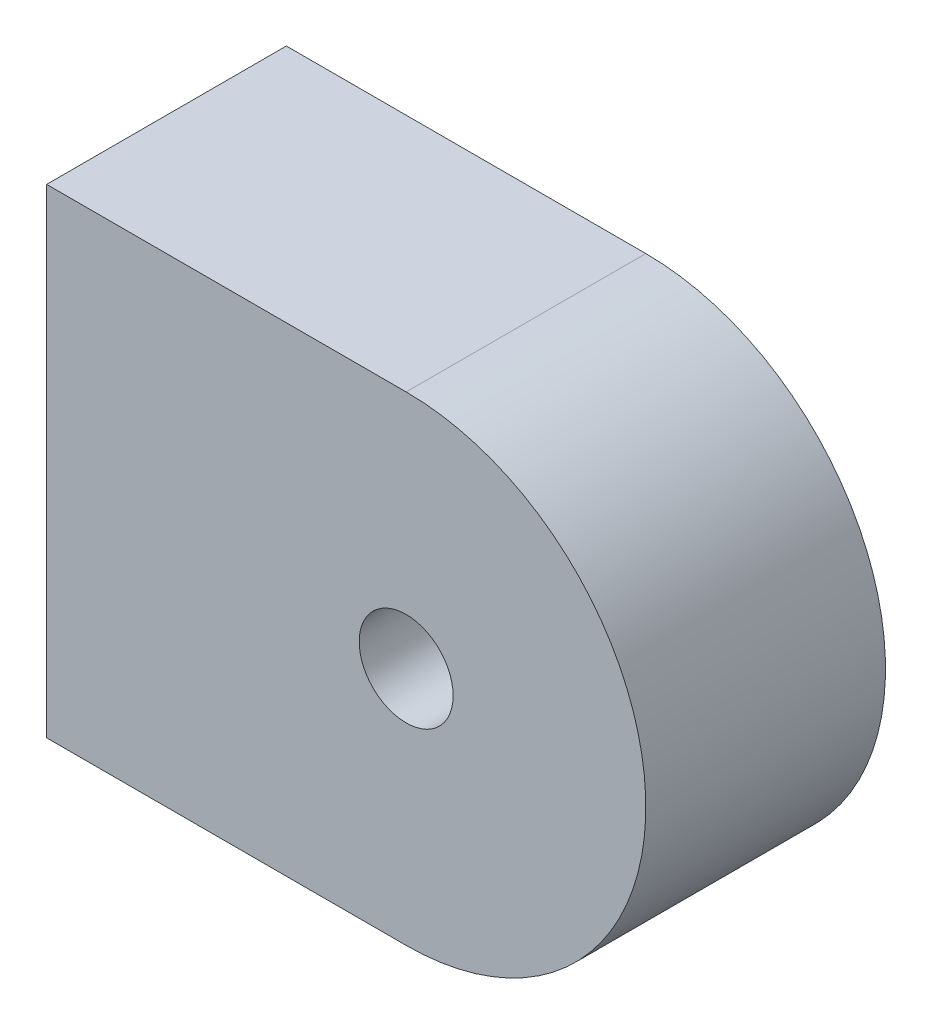
ISO-10303-21;
HEADER;
FILE_DESCRIPTION(('STEP AP214'),'2;1');
FILE_NAME('part.step','',(''),(''),'','','');
FILE_SCHEMA(('AUTOMOTIVE_DESIGN { 1 0 10303 214 1 1 1 1 }'));
ENDSEC;
DATA;
#1=APPLICATION_CONTEXT('core data for automotive mechanical design processes');
#2=APPLICATION_PROTOCOL_DEFINITION('international standard','automotive_design',2000,#1);
#3=PRODUCT_CONTEXT('',#1,'mechanical');
#4=PRODUCT('Part','Part','',(#3));
#5=PRODUCT_RELATED_PRODUCT_CATEGORY('part','',(#4));
#6=PRODUCT_DEFINITION_FORMATION('','',#4);
#7=PRODUCT_DEFINITION_CONTEXT('part definition',#1,'design');
#8=PRODUCT_DEFINITION('design','',#6,#7);
#9=PRODUCT_DEFINITION_SHAPE('','',#8);
#10=(LENGTH_UNIT() NAMED_UNIT(*) SI_UNIT(.MILLI.,.METRE.));
#11=(NAMED_UNIT(*) PLANE_ANGLE_UNIT() SI_UNIT($,.RADIAN.));
#12=(NAMED_UNIT(*) SI_UNIT($,.STERADIAN.) SOLID_ANGLE_UNIT());
#13=UNCERTAINTY_MEASURE_WITH_UNIT(LENGTH_MEASURE(1.E-05),#10,'distance_accuracy_value','');
#14=(GEOMETRIC_REPRESENTATION_CONTEXT(3) GLOBAL_UNCERTAINTY_ASSIGNED_CONTEXT((#13)) GLOBAL_UNIT_ASSIGNED_CONTEXT((#10,
#11,#12)) REPRESENTATION_CONTEXT('',''));
#15=CARTESIAN_POINT('',(0.,0.,0.));
#16=DIRECTION('',(0.,0.,1.));
#17=DIRECTION('',(1.,0.,0.));
#18=AXIS2_PLACEMENT_3D('',#15,#16,#17);
#19=CARTESIAN_POINT('',(31.7500000000001,645.8585,-12.7));
#20=DIRECTION('',(0.,0.,1.));
#21=DIRECTION('',(1.,0.,0.));
#22=AXIS2_PLACEMENT_3D('',#19,#20,#21);
#23=CYLINDRICAL_SURFACE('',#22,12.7);
#24=CARTESIAN_POINT('',(31.7500000000001,645.8585,0.));
#25=DIRECTION('',(0.,0.,1.));
#26=DIRECTION('',(1.,0.,0.));
#27=AXIS2_PLACEMENT_3D('',#24,#25,#26);
#28=CIRCLE('',#27,12.7);
#29=CARTESIAN_POINT('',(31.7500000000001,633.1585,0.));
#30=VERTEX_POINT('',#29);
#31=CARTESIAN_POINT('',(31.7500000000001,658.5585,0.));
#32=VERTEX_POINT('',#31);
#33=EDGE_CURVE('E104',#30,#32,#28,.T.);
#34=ORIENTED_EDGE('',*,*,#33,.F.);
#35=DIRECTION('',(0.,0.,1.));
#36=VECTOR('',#35,1.);
#37=CARTESIAN_POINT('',(31.7500000000001,633.1585,-12.7));
#38=LINE('',#37,#36);
#39=CARTESIAN_POINT('',(31.7500000000001,633.1585,-12.7));
#40=VERTEX_POINT('',#39);
#41=EDGE_CURVE('E11',#40,#30,#38,.T.);
#42=ORIENTED_EDGE('',*,*,#41,.F.);
#43=CARTESIAN_POINT('',(31.7500000000001,645.8585,-12.7));
#44=DIRECTION('',(0.,0.,1.));
#45=DIRECTION('',(1.,0.,0.));
#46=AXIS2_PLACEMENT_3D('',#43,#44,#45);
#47=CIRCLE('',#46,12.7);
#48=CARTESIAN_POINT('',(31.7500000000001,658.5585,-12.7));
#49=VERTEX_POINT('',#48);
#50=EDGE_CURVE('E97',#40,#49,#47,.T.);
#51=ORIENTED_EDGE('',*,*,#50,.T.);
#52=DIRECTION('',(0.,0.,1.));
#53=VECTOR('',#52,1.);
#54=CARTESIAN_POINT('',(31.7500000000001,658.5585,-12.7));
#55=LINE('',#54,#53);
#56=EDGE_CURVE('E42',#49,#32,#55,.T.);
#57=ORIENTED_EDGE('',*,*,#56,.T.);
#58=EDGE_LOOP('',(#34,#42,#51,#57));
#59=FACE_BOUND('',#58,.T.);
#60=ADVANCED_FACE('F39',(#59),#23,.T.);
#61=CARTESIAN_POINT('',(31.7500000000001,633.1585,-12.7));
#62=DIRECTION('',(0.,-1.,0.));
#63=DIRECTION('',(0.,0.,-1.));
#64=AXIS2_PLACEMENT_3D('',#61,#62,#63);
#65=PLANE('',#64);
#66=DIRECTION('',(1.,0.,0.));
#67=VECTOR('',#66,1.);
#68=CARTESIAN_POINT('',(31.7500000000001,633.1585,0.));
#69=LINE('',#68,#67);
#70=CARTESIAN_POINT('',(12.6999999999999,633.1585,0.));
#71=VERTEX_POINT('',#70);
#72=EDGE_CURVE('E99',#71,#30,#69,.T.);
#73=ORIENTED_EDGE('',*,*,#72,.F.);
#74=DIRECTION('',(0.,0.,1.));
#75=VECTOR('',#74,1.);
#76=CARTESIAN_POINT('',(12.6999999999999,633.1585,-12.7));
#77=LINE('',#76,#75);
#78=CARTESIAN_POINT('',(12.6999999999999,633.1585,-12.7));
#79=VERTEX_POINT('',#78);
#80=EDGE_CURVE('E48',#79,#71,#77,.T.);
#81=ORIENTED_EDGE('',*,*,#80,.F.);
#82=DIRECTION('',(1.,0.,0.));
#83=VECTOR('',#82,1.);
#84=CARTESIAN_POINT('',(31.7500000000001,633.1585,-12.7));
#85=LINE('',#84,#83);
#86=EDGE_CURVE('E94',#79,#40,#85,.T.);
#87=ORIENTED_EDGE('',*,*,#86,.T.);
#88=ORIENTED_EDGE('',*,*,#41,.T.);
#89=EDGE_LOOP('',(#73,#81,#87,#88));
#90=FACE_BOUND('',#89,.T.);
#91=ADVANCED_FACE('F115',(#90),#65,.T.);
#92=CARTESIAN_POINT('',(12.6999999999999,658.5585,-12.7));
#93=DIRECTION('',(-1.,0.,0.));
#94=DIRECTION('',(0.,-1.,0.));
#95=AXIS2_PLACEMENT_3D('',#92,#93,#94);
#96=PLANE('',#95);
#97=DIRECTION('',(0.,-1.,0.));
#98=VECTOR('',#97,1.);
#99=CARTESIAN_POINT('',(12.6999999999999,658.5585,0.));
#100=LINE('',#99,#98);
#101=CARTESIAN_POINT('',(12.6999999999999,658.5585,0.));
#102=VERTEX_POINT('',#101);
#103=EDGE_CURVE('E89',#102,#71,#100,.T.);
#104=ORIENTED_EDGE('',*,*,#103,.F.);
#105=DIRECTION('',(0.,0.,1.));
#106=VECTOR('',#105,1.);
#107=CARTESIAN_POINT('',(12.6999999999999,658.5585,-12.7));
#108=LINE('',#107,#106);
#109=CARTESIAN_POINT('',(12.6999999999999,658.5585,-12.7));
#110=VERTEX_POINT('',#109);
#111=EDGE_CURVE('E84',#110,#102,#108,.T.);
#112=ORIENTED_EDGE('',*,*,#111,.F.);
#113=DIRECTION('',(0.,-1.,0.));
#114=VECTOR('',#113,1.);
#115=CARTESIAN_POINT('',(12.6999999999999,658.5585,-12.7));
#116=LINE('',#115,#114);
#117=EDGE_CURVE('E87',#110,#79,#116,.T.);
#118=ORIENTED_EDGE('',*,*,#117,.T.);
#119=ORIENTED_EDGE('',*,*,#80,.T.);
#120=EDGE_LOOP('',(#104,#112,#118,#119));
#121=FACE_BOUND('',#120,.T.);
#122=ADVANCED_FACE('F86',(#121),#96,.T.);
#123=CARTESIAN_POINT('',(31.7500000000001,658.5585,-12.7));
#124=DIRECTION('',(0.,1.,0.));
#125=DIRECTION('',(-1.,0.,0.));
#126=AXIS2_PLACEMENT_3D('',#123,#124,#125);
#127=PLANE('',#126);
#128=DIRECTION('',(-1.,0.,0.));
#129=VECTOR('',#128,1.);
#130=CARTESIAN_POINT('',(31.7500000000001,658.5585,0.));
#131=LINE('',#130,#129);
#132=EDGE_CURVE('E107',#32,#102,#131,.T.);
#133=ORIENTED_EDGE('',*,*,#132,.F.);
#134=ORIENTED_EDGE('',*,*,#56,.F.);
#135=DIRECTION('',(-1.,0.,0.));
#136=VECTOR('',#135,1.);
#137=CARTESIAN_POINT('',(31.7500000000001,658.5585,-12.7));
#138=LINE('',#137,#136);
#139=EDGE_CURVE('E93',#49,#110,#138,.T.);
#140=ORIENTED_EDGE('',*,*,#139,.T.);
#141=ORIENTED_EDGE('',*,*,#111,.T.);
#142=EDGE_LOOP('',(#133,#134,#140,#141));
#143=FACE_BOUND('',#142,.T.);
#144=ADVANCED_FACE('F96',(#143),#127,.T.);
#145=CARTESIAN_POINT('',(31.7500000000001,645.8585,-12.7));
#146=DIRECTION('',(0.,0.,1.));
#147=DIRECTION('',(1.,0.,0.));
#148=AXIS2_PLACEMENT_3D('',#145,#146,#147);
#149=PLANE('',#148);
#150=CARTESIAN_POINT('',(31.7500000000001,645.8585,-12.7));
#151=DIRECTION('',(0.,0.,1.));
#152=DIRECTION('',(1.,0.,0.));
#153=AXIS2_PLACEMENT_3D('',#150,#151,#152);
#154=CIRCLE('',#153,2.48919999999996);
#155=CARTESIAN_POINT('',(34.2392,645.8585,-12.7));
#156=VERTEX_POINT('',#155);
#157=EDGE_CURVE('E108',#156,#156,#154,.T.);
#158=ORIENTED_EDGE('',*,*,#157,.T.);
#159=EDGE_LOOP('',(#158));
#160=FACE_BOUND('',#159,.T.);
#161=ORIENTED_EDGE('',*,*,#50,.F.);
#162=ORIENTED_EDGE('',*,*,#86,.F.);
#163=ORIENTED_EDGE('',*,*,#117,.F.);
#164=ORIENTED_EDGE('',*,*,#139,.F.);
#165=EDGE_LOOP('',(#161,#162,#163,#164));
#166=FACE_BOUND('',#165,.T.);
#167=ADVANCED_FACE('F92',(#160,#166),#149,.F.);
#168=CARTESIAN_POINT('',(31.7500000000001,645.8585,0.));
#169=DIRECTION('',(0.,0.,1.));
#170=DIRECTION('',(1.,0.,0.));
#171=AXIS2_PLACEMENT_3D('',#168,#169,#170);
#172=PLANE('',#171);
#173=CARTESIAN_POINT('',(31.7500000000001,645.8585,0.));
#174=DIRECTION('',(0.,0.,1.));
#175=DIRECTION('',(1.,0.,0.));
#176=AXIS2_PLACEMENT_3D('',#173,#174,#175);
#177=CIRCLE('',#176,2.48919999999996);
#178=CARTESIAN_POINT('',(34.2392,645.8585,0.));
#179=VERTEX_POINT('',#178);
#180=EDGE_CURVE('E145',#179,#179,#177,.T.);
#181=ORIENTED_EDGE('',*,*,#180,.F.);
#182=EDGE_LOOP('',(#181));
#183=FACE_BOUND('',#182,.T.);
#184=ORIENTED_EDGE('',*,*,#33,.T.);
#185=ORIENTED_EDGE('',*,*,#132,.T.);
#186=ORIENTED_EDGE('',*,*,#103,.T.);
#187=ORIENTED_EDGE('',*,*,#72,.T.);
#188=EDGE_LOOP('',(#184,#185,#186,#187));
#189=FACE_BOUND('',#188,.T.);
#190=ADVANCED_FACE('F114',(#183,#189),#172,.T.);
#191=CARTESIAN_POINT('',(31.7500000000001,645.8585,-12.7));
#192=DIRECTION('',(0.,0.,1.));
#193=DIRECTION('',(1.,0.,0.));
#194=AXIS2_PLACEMENT_3D('',#191,#192,#193);
#195=CYLINDRICAL_SURFACE('',#194,2.48919999999996);
#196=ORIENTED_EDGE('',*,*,#157,.F.);
#197=EDGE_LOOP('',(#196));
#198=FACE_BOUND('',#197,.T.);
#199=ORIENTED_EDGE('',*,*,#180,.T.);
#200=EDGE_LOOP('',(#199));
#201=FACE_BOUND('',#200,.T.);
#202=ADVANCED_FACE('F133',(#198,#201),#195,.F.);
#203=CLOSED_SHELL('',(#60,#91,#122,#144,#167,#190,#202));
#204=MANIFOLD_SOLID_BREP('B2',#203);
#205=ADVANCED_BREP_SHAPE_REPRESENTATION('',(#18,#204),#14);
#206=SHAPE_DEFINITION_REPRESENTATION(#9,#205);
ENDSEC;
END-ISO-10303-21;
